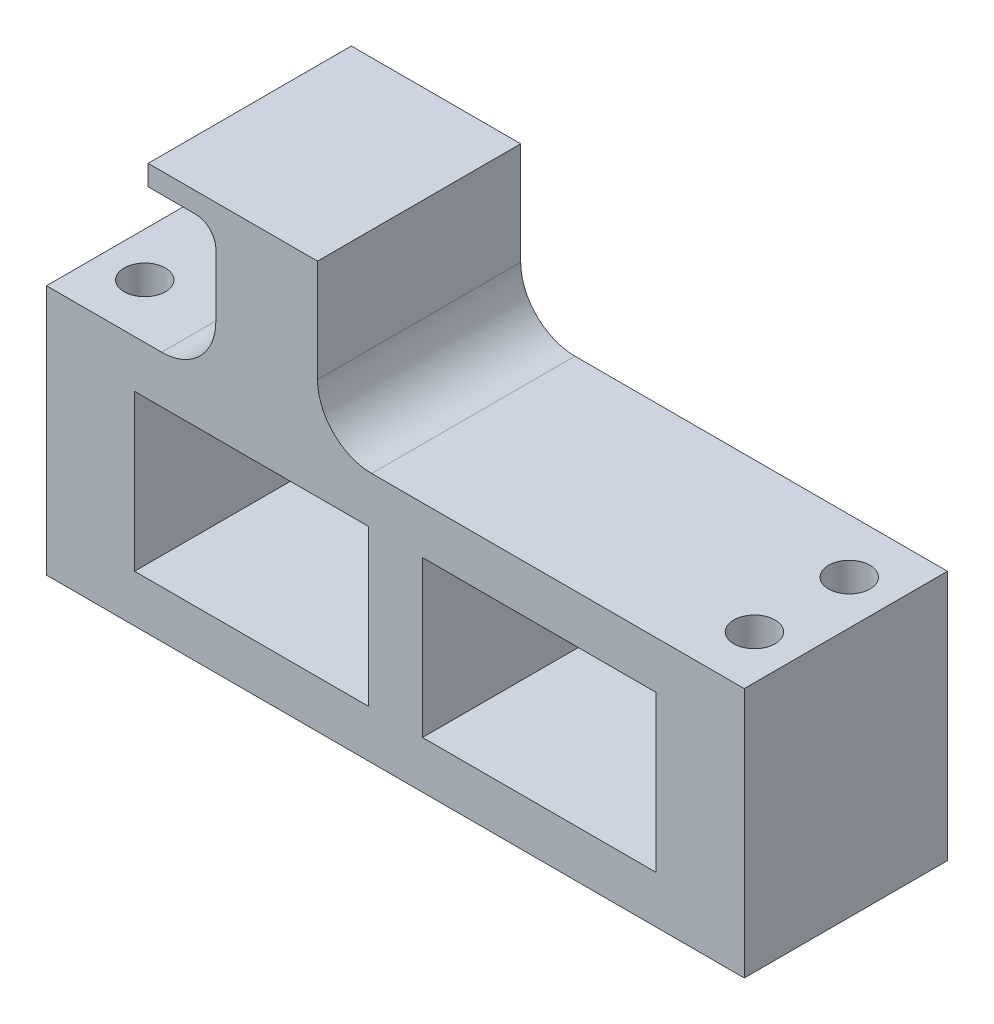
ISO-10303-21;
HEADER;
FILE_DESCRIPTION(('STEP AP214'),'2;1');
FILE_NAME('part.step','',(''),(''),'','','');
FILE_SCHEMA(('AUTOMOTIVE_DESIGN { 1 0 10303 214 1 1 1 1 }'));
ENDSEC;
DATA;
#1=APPLICATION_CONTEXT('core data for automotive mechanical design processes');
#2=APPLICATION_PROTOCOL_DEFINITION('international standard','automotive_design',2000,#1);
#3=PRODUCT_CONTEXT('',#1,'mechanical');
#4=PRODUCT('Part','Part','',(#3));
#5=PRODUCT_RELATED_PRODUCT_CATEGORY('part','',(#4));
#6=PRODUCT_DEFINITION_FORMATION('','',#4);
#7=PRODUCT_DEFINITION_CONTEXT('part definition',#1,'design');
#8=PRODUCT_DEFINITION('design','',#6,#7);
#9=PRODUCT_DEFINITION_SHAPE('','',#8);
#10=(LENGTH_UNIT() NAMED_UNIT(*) SI_UNIT(.MILLI.,.METRE.));
#11=(NAMED_UNIT(*) PLANE_ANGLE_UNIT() SI_UNIT($,.RADIAN.));
#12=(NAMED_UNIT(*) SI_UNIT($,.STERADIAN.) SOLID_ANGLE_UNIT());
#13=UNCERTAINTY_MEASURE_WITH_UNIT(LENGTH_MEASURE(1.E-05),#10,'distance_accuracy_value','');
#14=(GEOMETRIC_REPRESENTATION_CONTEXT(3) GLOBAL_UNCERTAINTY_ASSIGNED_CONTEXT((#13)) GLOBAL_UNIT_ASSIGNED_CONTEXT((#10,
#11,#12)) REPRESENTATION_CONTEXT('',''));
#15=CARTESIAN_POINT('',(0.,0.,0.));
#16=DIRECTION('',(0.,0.,1.));
#17=DIRECTION('',(1.,0.,0.));
#18=AXIS2_PLACEMENT_3D('',#15,#16,#17);
#19=CARTESIAN_POINT('',(0.,37.,0.));
#20=DIRECTION('',(0.,-1.,0.));
#21=DIRECTION('',(0.,0.,-1.));
#22=AXIS2_PLACEMENT_3D('',#19,#20,#21);
#23=PLANE('',#22);
#24=CARTESIAN_POINT('',(6.5,37.,-8.));
#25=DIRECTION('',(0.,-1.,0.));
#26=DIRECTION('',(0.,0.,-1.));
#27=AXIS2_PLACEMENT_3D('',#24,#25,#26);
#28=CIRCLE('',#27,3.05);
#29=CARTESIAN_POINT('',(6.5,37.,-11.05));
#30=VERTEX_POINT('',#29);
#31=EDGE_CURVE('E385',#30,#30,#28,.T.);
#32=ORIENTED_EDGE('',*,*,#31,.T.);
#33=EDGE_LOOP('',(#32));
#34=FACE_BOUND('',#33,.T.);
#35=CARTESIAN_POINT('',(6.5,37.,-22.));
#36=DIRECTION('',(0.,-1.,0.));
#37=DIRECTION('',(0.,0.,-1.));
#38=AXIS2_PLACEMENT_3D('',#35,#36,#37);
#39=CIRCLE('',#38,3.05);
#40=CARTESIAN_POINT('',(6.5,37.,-25.05));
#41=VERTEX_POINT('',#40);
#42=EDGE_CURVE('E388',#41,#41,#39,.T.);
#43=ORIENTED_EDGE('',*,*,#42,.T.);
#44=EDGE_LOOP('',(#43));
#45=FACE_BOUND('',#44,.T.);
#46=DIRECTION('',(1.,0.,0.));
#47=VECTOR('',#46,1.);
#48=CARTESIAN_POINT('',(0.,37.,0.));
#49=LINE('',#48,#47);
#50=CARTESIAN_POINT('',(0.,37.,0.));
#51=VERTEX_POINT('',#50);
#52=CARTESIAN_POINT('',(17.,37.,0.));
#53=VERTEX_POINT('',#52);
#54=EDGE_CURVE('E224',#51,#53,#49,.T.);
#55=ORIENTED_EDGE('',*,*,#54,.T.);
#56=DIRECTION('',(0.,0.,1.));
#57=VECTOR('',#56,1.);
#58=CARTESIAN_POINT('',(17.,37.,-30.));
#59=LINE('',#58,#57);
#60=CARTESIAN_POINT('',(17.,37.,-30.));
#61=VERTEX_POINT('',#60);
#62=EDGE_CURVE('E57',#53,#61,#59,.F.);
#63=ORIENTED_EDGE('',*,*,#62,.T.);
#64=DIRECTION('',(-1.,0.,0.));
#65=VECTOR('',#64,1.);
#66=CARTESIAN_POINT('',(0.,37.,-30.));
#67=LINE('',#66,#65);
#68=CARTESIAN_POINT('',(0.,37.,-30.));
#69=VERTEX_POINT('',#68);
#70=EDGE_CURVE('E229',#61,#69,#67,.T.);
#71=ORIENTED_EDGE('',*,*,#70,.T.);
#72=DIRECTION('',(0.,0.,1.));
#73=VECTOR('',#72,1.);
#74=CARTESIAN_POINT('',(0.,37.,0.));
#75=LINE('',#74,#73);
#76=EDGE_CURVE('E219',#69,#51,#75,.T.);
#77=ORIENTED_EDGE('',*,*,#76,.T.);
#78=EDGE_LOOP('',(#55,#63,#71,#77));
#79=FACE_BOUND('',#78,.T.);
#80=ADVANCED_FACE('F36',(#34,#45,#79),#23,.F.);
#81=CARTESIAN_POINT('',(96.5,37.,-22.));
#82=DIRECTION('',(0.,-1.,0.));
#83=DIRECTION('',(0.,0.,-1.));
#84=AXIS2_PLACEMENT_3D('',#81,#82,#83);
#85=CIRCLE('',#84,3.04999999999999);
#86=CARTESIAN_POINT('',(96.5,37.,-25.05));
#87=VERTEX_POINT('',#86);
#88=EDGE_CURVE('E377',#87,#87,#85,.T.);
#89=ORIENTED_EDGE('',*,*,#88,.T.);
#90=EDGE_LOOP('',(#89));
#91=FACE_BOUND('',#90,.T.);
#92=CARTESIAN_POINT('',(96.5,37.,-8.));
#93=DIRECTION('',(0.,-1.,0.));
#94=DIRECTION('',(0.,0.,-1.));
#95=AXIS2_PLACEMENT_3D('',#92,#93,#94);
#96=CIRCLE('',#95,3.04999999999999);
#97=CARTESIAN_POINT('',(96.5,37.,-11.05));
#98=VERTEX_POINT('',#97);
#99=EDGE_CURVE('E382',#98,#98,#96,.T.);
#100=ORIENTED_EDGE('',*,*,#99,.T.);
#101=EDGE_LOOP('',(#100));
#102=FACE_BOUND('',#101,.T.);
#103=CARTESIAN_POINT('',(103.,37.,-30.));
#104=VERTEX_POINT('',#103);
#105=CARTESIAN_POINT('',(48.,37.,-30.));
#106=VERTEX_POINT('',#105);
#107=EDGE_CURVE('E230',#104,#106,#67,.T.);
#108=ORIENTED_EDGE('',*,*,#107,.T.);
#109=DIRECTION('',(0.,0.,-1.));
#110=VECTOR('',#109,1.);
#111=CARTESIAN_POINT('',(48.,37.,0.));
#112=LINE('',#111,#110);
#113=CARTESIAN_POINT('',(48.,37.,0.));
#114=VERTEX_POINT('',#113);
#115=EDGE_CURVE('E321',#106,#114,#112,.F.);
#116=ORIENTED_EDGE('',*,*,#115,.T.);
#117=CARTESIAN_POINT('',(103.,37.,0.));
#118=VERTEX_POINT('',#117);
#119=EDGE_CURVE('E222',#114,#118,#49,.T.);
#120=ORIENTED_EDGE('',*,*,#119,.T.);
#121=DIRECTION('',(0.,0.,-1.));
#122=VECTOR('',#121,1.);
#123=CARTESIAN_POINT('',(103.,37.,0.));
#124=LINE('',#123,#122);
#125=EDGE_CURVE('E226',#118,#104,#124,.T.);
#126=ORIENTED_EDGE('',*,*,#125,.T.);
#127=EDGE_LOOP('',(#108,#116,#120,#126));
#128=FACE_BOUND('',#127,.T.);
#129=ADVANCED_FACE('F345',(#91,#102,#128),#23,.F.);
#130=CARTESIAN_POINT('',(0.,7.,0.));
#131=DIRECTION('',(0.,-1.,0.));
#132=DIRECTION('',(0.,0.,-1.));
#133=AXIS2_PLACEMENT_3D('',#130,#131,#132);
#134=PLANE('',#133);
#135=DIRECTION('',(0.,0.,1.));
#136=VECTOR('',#135,1.);
#137=CARTESIAN_POINT('',(47.5,7.,0.));
#138=LINE('',#137,#136);
#139=CARTESIAN_POINT('',(47.5,7.,-30.));
#140=VERTEX_POINT('',#139);
#141=CARTESIAN_POINT('',(47.5,7.,0.));
#142=VERTEX_POINT('',#141);
#143=EDGE_CURVE('E248',#140,#142,#138,.T.);
#144=ORIENTED_EDGE('',*,*,#143,.F.);
#145=DIRECTION('',(1.,0.,0.));
#146=VECTOR('',#145,1.);
#147=CARTESIAN_POINT('',(0.,7.,-30.));
#148=LINE('',#147,#146);
#149=CARTESIAN_POINT('',(13.,7.,-30.));
#150=VERTEX_POINT('',#149);
#151=EDGE_CURVE('E282',#150,#140,#148,.T.);
#152=ORIENTED_EDGE('',*,*,#151,.F.);
#153=DIRECTION('',(0.,0.,-1.));
#154=VECTOR('',#153,1.);
#155=CARTESIAN_POINT('',(13.,7.,0.));
#156=LINE('',#155,#154);
#157=CARTESIAN_POINT('',(13.,7.,0.));
#158=VERTEX_POINT('',#157);
#159=EDGE_CURVE('E269',#158,#150,#156,.T.);
#160=ORIENTED_EDGE('',*,*,#159,.F.);
#161=DIRECTION('',(1.,0.,0.));
#162=VECTOR('',#161,1.);
#163=CARTESIAN_POINT('',(0.,7.,0.));
#164=LINE('',#163,#162);
#165=EDGE_CURVE('E287',#158,#142,#164,.T.);
#166=ORIENTED_EDGE('',*,*,#165,.T.);
#167=EDGE_LOOP('',(#144,#152,#160,#166));
#168=FACE_BOUND('',#167,.T.);
#169=ADVANCED_FACE('F426',(#168),#134,.F.);
#170=CARTESIAN_POINT('',(55.5,7.,0.));
#171=VERTEX_POINT('',#170);
#172=CARTESIAN_POINT('',(90.,7.,0.));
#173=VERTEX_POINT('',#172);
#174=EDGE_CURVE('E285',#171,#173,#164,.T.);
#175=ORIENTED_EDGE('',*,*,#174,.T.);
#176=DIRECTION('',(0.,0.,-1.));
#177=VECTOR('',#176,1.);
#178=CARTESIAN_POINT('',(90.,7.,0.));
#179=LINE('',#178,#177);
#180=CARTESIAN_POINT('',(90.,7.,-30.));
#181=VERTEX_POINT('',#180);
#182=EDGE_CURVE('E233',#173,#181,#179,.T.);
#183=ORIENTED_EDGE('',*,*,#182,.T.);
#184=CARTESIAN_POINT('',(55.5,7.,-30.));
#185=VERTEX_POINT('',#184);
#186=EDGE_CURVE('E286',#185,#181,#148,.T.);
#187=ORIENTED_EDGE('',*,*,#186,.F.);
#188=DIRECTION('',(0.,0.,1.));
#189=VECTOR('',#188,1.);
#190=CARTESIAN_POINT('',(55.5,7.,0.));
#191=LINE('',#190,#189);
#192=EDGE_CURVE('E253',#185,#171,#191,.T.);
#193=ORIENTED_EDGE('',*,*,#192,.T.);
#194=EDGE_LOOP('',(#175,#183,#187,#193));
#195=FACE_BOUND('',#194,.T.);
#196=ADVANCED_FACE('F451',(#195),#134,.F.);
#197=CARTESIAN_POINT('',(0.,7.,0.));
#198=DIRECTION('',(-1.,0.,0.));
#199=DIRECTION('',(0.,0.,1.));
#200=AXIS2_PLACEMENT_3D('',#197,#198,#199);
#201=PLANE('',#200);
#202=DIRECTION('',(0.,0.,-1.));
#203=VECTOR('',#202,1.);
#204=CARTESIAN_POINT('',(0.,0.,0.));
#205=LINE('',#204,#203);
#206=CARTESIAN_POINT('',(0.,0.,0.));
#207=VERTEX_POINT('',#206);
#208=CARTESIAN_POINT('',(0.,0.,-30.));
#209=VERTEX_POINT('',#208);
#210=EDGE_CURVE('E281',#207,#209,#205,.T.);
#211=ORIENTED_EDGE('',*,*,#210,.F.);
#212=DIRECTION('',(0.,-1.,0.));
#213=VECTOR('',#212,1.);
#214=CARTESIAN_POINT('',(0.,7.,0.));
#215=LINE('',#214,#213);
#216=EDGE_CURVE('E301',#51,#207,#215,.T.);
#217=ORIENTED_EDGE('',*,*,#216,.F.);
#218=ORIENTED_EDGE('',*,*,#76,.F.);
#219=DIRECTION('',(0.,-1.,0.));
#220=VECTOR('',#219,1.);
#221=CARTESIAN_POINT('',(0.,7.,-30.));
#222=LINE('',#221,#220);
#223=EDGE_CURVE('E290',#69,#209,#222,.T.);
#224=ORIENTED_EDGE('',*,*,#223,.T.);
#225=EDGE_LOOP('',(#211,#217,#218,#224));
#226=FACE_BOUND('',#225,.T.);
#227=ADVANCED_FACE('F357',(#226),#201,.T.);
#228=CARTESIAN_POINT('',(0.,7.,0.));
#229=DIRECTION('',(0.,0.,-1.));
#230=DIRECTION('',(-1.,0.,0.));
#231=AXIS2_PLACEMENT_3D('',#228,#229,#230);
#232=PLANE('',#231);
#233=DIRECTION('',(0.,-1.,0.));
#234=VECTOR('',#233,1.);
#235=CARTESIAN_POINT('',(13.,30.,0.));
#236=LINE('',#235,#234);
#237=CARTESIAN_POINT('',(13.,30.,0.));
#238=VERTEX_POINT('',#237);
#239=EDGE_CURVE('E278',#238,#158,#236,.T.);
#240=ORIENTED_EDGE('',*,*,#239,.F.);
#241=DIRECTION('',(1.,0.,0.));
#242=VECTOR('',#241,1.);
#243=CARTESIAN_POINT('',(0.,30.,0.));
#244=LINE('',#243,#242);
#245=CARTESIAN_POINT('',(47.5,30.,0.));
#246=VERTEX_POINT('',#245);
#247=EDGE_CURVE('E236',#238,#246,#244,.T.);
#248=ORIENTED_EDGE('',*,*,#247,.T.);
#249=DIRECTION('',(0.,-1.,0.));
#250=VECTOR('',#249,1.);
#251=CARTESIAN_POINT('',(47.5,30.,0.));
#252=LINE('',#251,#250);
#253=EDGE_CURVE('E264',#246,#142,#252,.T.);
#254=ORIENTED_EDGE('',*,*,#253,.T.);
#255=ORIENTED_EDGE('',*,*,#165,.F.);
#256=EDGE_LOOP('',(#240,#248,#254,#255));
#257=FACE_BOUND('',#256,.T.);
#258=DIRECTION('',(0.,-1.,0.));
#259=VECTOR('',#258,1.);
#260=CARTESIAN_POINT('',(55.5,30.,0.));
#261=LINE('',#260,#259);
#262=CARTESIAN_POINT('',(55.5,30.,0.));
#263=VERTEX_POINT('',#262);
#264=EDGE_CURVE('E262',#263,#171,#261,.T.);
#265=ORIENTED_EDGE('',*,*,#264,.F.);
#266=CARTESIAN_POINT('',(90.,30.,0.));
#267=VERTEX_POINT('',#266);
#268=EDGE_CURVE('E218',#263,#267,#244,.T.);
#269=ORIENTED_EDGE('',*,*,#268,.T.);
#270=DIRECTION('',(0.,-1.,0.));
#271=VECTOR('',#270,1.);
#272=CARTESIAN_POINT('',(90.,30.,0.));
#273=LINE('',#272,#271);
#274=EDGE_CURVE('E246',#267,#173,#273,.T.);
#275=ORIENTED_EDGE('',*,*,#274,.T.);
#276=ORIENTED_EDGE('',*,*,#174,.F.);
#277=EDGE_LOOP('',(#265,#269,#275,#276));
#278=FACE_BOUND('',#277,.T.);
#279=DIRECTION('',(1.,0.,0.));
#280=VECTOR('',#279,1.);
#281=CARTESIAN_POINT('',(0.,0.,0.));
#282=LINE('',#281,#280);
#283=CARTESIAN_POINT('',(103.,0.,0.));
#284=VERTEX_POINT('',#283);
#285=EDGE_CURVE('E299',#207,#284,#282,.T.);
#286=ORIENTED_EDGE('',*,*,#285,.T.);
#287=DIRECTION('',(0.,-1.,0.));
#288=VECTOR('',#287,1.);
#289=CARTESIAN_POINT('',(103.,7.,0.));
#290=LINE('',#289,#288);
#291=EDGE_CURVE('E304',#118,#284,#290,.T.);
#292=ORIENTED_EDGE('',*,*,#291,.F.);
#293=ORIENTED_EDGE('',*,*,#119,.F.);
#294=CARTESIAN_POINT('',(48.,45.,0.));
#295=DIRECTION('',(0.,0.,-1.));
#296=DIRECTION('',(-1.,0.,0.));
#297=AXIS2_PLACEMENT_3D('',#294,#295,#296);
#298=CIRCLE('',#297,8.);
#299=CARTESIAN_POINT('',(40.,45.,0.));
#300=VERTEX_POINT('',#299);
#301=EDGE_CURVE('E329',#114,#300,#298,.T.);
#302=ORIENTED_EDGE('',*,*,#301,.T.);
#303=DIRECTION('',(0.,-1.,0.));
#304=VECTOR('',#303,1.);
#305=CARTESIAN_POINT('',(40.,57.15,0.));
#306=LINE('',#305,#304);
#307=CARTESIAN_POINT('',(40.,60.15,0.));
#308=VERTEX_POINT('',#307);
#309=EDGE_CURVE('E185',#308,#300,#306,.T.);
#310=ORIENTED_EDGE('',*,*,#309,.F.);
#311=DIRECTION('',(1.,0.,0.));
#312=VECTOR('',#311,1.);
#313=CARTESIAN_POINT('',(15.,60.15,0.));
#314=LINE('',#313,#312);
#315=CARTESIAN_POINT('',(15.,60.15,0.));
#316=VERTEX_POINT('',#315);
#317=EDGE_CURVE('E177',#316,#308,#314,.T.);
#318=ORIENTED_EDGE('',*,*,#317,.F.);
#319=DIRECTION('',(0.,-1.,0.));
#320=VECTOR('',#319,1.);
#321=CARTESIAN_POINT('',(15.,60.15,0.));
#322=LINE('',#321,#320);
#323=CARTESIAN_POINT('',(15.,57.15,0.));
#324=VERTEX_POINT('',#323);
#325=EDGE_CURVE('E182',#316,#324,#322,.T.);
#326=ORIENTED_EDGE('',*,*,#325,.T.);
#327=DIRECTION('',(1.,0.,0.));
#328=VECTOR('',#327,1.);
#329=CARTESIAN_POINT('',(15.,57.15,0.));
#330=LINE('',#329,#328);
#331=CARTESIAN_POINT('',(22.,57.15,0.));
#332=VERTEX_POINT('',#331);
#333=EDGE_CURVE('E366',#324,#332,#330,.T.);
#334=ORIENTED_EDGE('',*,*,#333,.T.);
#335=CARTESIAN_POINT('',(22.,54.15,0.));
#336=DIRECTION('',(0.,0.,-1.));
#337=DIRECTION('',(-1.,0.,0.));
#338=AXIS2_PLACEMENT_3D('',#335,#336,#337);
#339=CIRCLE('',#338,3.);
#340=CARTESIAN_POINT('',(25.,54.15,0.));
#341=VERTEX_POINT('',#340);
#342=EDGE_CURVE('E314',#332,#341,#339,.T.);
#343=ORIENTED_EDGE('',*,*,#342,.T.);
#344=DIRECTION('',(0.,-1.,0.));
#345=VECTOR('',#344,1.);
#346=CARTESIAN_POINT('',(25.,57.15,0.));
#347=LINE('',#346,#345);
#348=CARTESIAN_POINT('',(25.,45.,0.));
#349=VERTEX_POINT('',#348);
#350=EDGE_CURVE('E216',#341,#349,#347,.T.);
#351=ORIENTED_EDGE('',*,*,#350,.T.);
#352=CARTESIAN_POINT('',(17.,45.,0.));
#353=DIRECTION('',(0.,0.,-1.));
#354=DIRECTION('',(-1.,0.,0.));
#355=AXIS2_PLACEMENT_3D('',#352,#353,#354);
#356=CIRCLE('',#355,8.);
#357=EDGE_CURVE('E44',#349,#53,#356,.T.);
#358=ORIENTED_EDGE('',*,*,#357,.T.);
#359=ORIENTED_EDGE('',*,*,#54,.F.);
#360=ORIENTED_EDGE('',*,*,#216,.T.);
#361=EDGE_LOOP('',(#286,#292,#293,#302,#310,#318,#326,#334,#343,#351,#358,#359,#360));
#362=FACE_BOUND('',#361,.T.);
#363=ADVANCED_FACE('F179',(#257,#278,#362),#232,.F.);
#364=CARTESIAN_POINT('',(103.,7.,0.));
#365=DIRECTION('',(-1.,0.,0.));
#366=DIRECTION('',(0.,0.,1.));
#367=AXIS2_PLACEMENT_3D('',#364,#365,#366);
#368=PLANE('',#367);
#369=DIRECTION('',(0.,0.,-1.));
#370=VECTOR('',#369,1.);
#371=CARTESIAN_POINT('',(103.,0.,0.));
#372=LINE('',#371,#370);
#373=CARTESIAN_POINT('',(103.,0.,-30.));
#374=VERTEX_POINT('',#373);
#375=EDGE_CURVE('E296',#284,#374,#372,.T.);
#376=ORIENTED_EDGE('',*,*,#375,.T.);
#377=DIRECTION('',(0.,-1.,0.));
#378=VECTOR('',#377,1.);
#379=CARTESIAN_POINT('',(103.,7.,-30.));
#380=LINE('',#379,#378);
#381=EDGE_CURVE('E307',#104,#374,#380,.T.);
#382=ORIENTED_EDGE('',*,*,#381,.F.);
#383=ORIENTED_EDGE('',*,*,#125,.F.);
#384=ORIENTED_EDGE('',*,*,#291,.T.);
#385=EDGE_LOOP('',(#376,#382,#383,#384));
#386=FACE_BOUND('',#385,.T.);
#387=ADVANCED_FACE('F348',(#386),#368,.F.);
#388=CARTESIAN_POINT('',(0.,7.,-30.));
#389=DIRECTION('',(0.,0.,-1.));
#390=DIRECTION('',(-1.,0.,0.));
#391=AXIS2_PLACEMENT_3D('',#388,#389,#390);
#392=PLANE('',#391);
#393=ORIENTED_EDGE('',*,*,#223,.F.);
#394=ORIENTED_EDGE('',*,*,#70,.F.);
#395=CARTESIAN_POINT('',(17.,45.,-30.));
#396=DIRECTION('',(0.,0.,-1.));
#397=DIRECTION('',(-1.,0.,0.));
#398=AXIS2_PLACEMENT_3D('',#395,#396,#397);
#399=CIRCLE('',#398,8.);
#400=CARTESIAN_POINT('',(25.,45.,-30.));
#401=VERTEX_POINT('',#400);
#402=EDGE_CURVE('E11',#61,#401,#399,.F.);
#403=ORIENTED_EDGE('',*,*,#402,.T.);
#404=DIRECTION('',(0.,-1.,0.));
#405=VECTOR('',#404,1.);
#406=CARTESIAN_POINT('',(25.,57.15,-30.));
#407=LINE('',#406,#405);
#408=CARTESIAN_POINT('',(25.,54.15,-30.));
#409=VERTEX_POINT('',#408);
#410=EDGE_CURVE('E204',#409,#401,#407,.T.);
#411=ORIENTED_EDGE('',*,*,#410,.F.);
#412=CARTESIAN_POINT('',(22.,54.15,-30.));
#413=DIRECTION('',(0.,0.,-1.));
#414=DIRECTION('',(-1.,0.,0.));
#415=AXIS2_PLACEMENT_3D('',#412,#413,#414);
#416=CIRCLE('',#415,3.);
#417=CARTESIAN_POINT('',(22.,57.15,-30.));
#418=VERTEX_POINT('',#417);
#419=EDGE_CURVE('E316',#409,#418,#416,.F.);
#420=ORIENTED_EDGE('',*,*,#419,.T.);
#421=DIRECTION('',(-1.,0.,0.));
#422=VECTOR('',#421,1.);
#423=CARTESIAN_POINT('',(15.,57.15,-30.));
#424=LINE('',#423,#422);
#425=CARTESIAN_POINT('',(15.,57.15,-30.));
#426=VERTEX_POINT('',#425);
#427=EDGE_CURVE('E199',#418,#426,#424,.T.);
#428=ORIENTED_EDGE('',*,*,#427,.T.);
#429=DIRECTION('',(0.,-1.,0.));
#430=VECTOR('',#429,1.);
#431=CARTESIAN_POINT('',(15.,60.15,-30.));
#432=LINE('',#431,#430);
#433=CARTESIAN_POINT('',(15.,60.15,-30.));
#434=VERTEX_POINT('',#433);
#435=EDGE_CURVE('E205',#434,#426,#432,.T.);
#436=ORIENTED_EDGE('',*,*,#435,.F.);
#437=DIRECTION('',(-1.,0.,0.));
#438=VECTOR('',#437,1.);
#439=CARTESIAN_POINT('',(15.,60.15,-30.));
#440=LINE('',#439,#438);
#441=CARTESIAN_POINT('',(40.,60.15,-30.));
#442=VERTEX_POINT('',#441);
#443=EDGE_CURVE('E195',#442,#434,#440,.T.);
#444=ORIENTED_EDGE('',*,*,#443,.F.);
#445=DIRECTION('',(0.,-1.,0.));
#446=VECTOR('',#445,1.);
#447=CARTESIAN_POINT('',(40.,57.15,-30.));
#448=LINE('',#447,#446);
#449=CARTESIAN_POINT('',(40.,45.,-30.));
#450=VERTEX_POINT('',#449);
#451=EDGE_CURVE('E208',#442,#450,#448,.T.);
#452=ORIENTED_EDGE('',*,*,#451,.T.);
#453=CARTESIAN_POINT('',(48.,45.,-30.));
#454=DIRECTION('',(0.,0.,-1.));
#455=DIRECTION('',(-1.,0.,0.));
#456=AXIS2_PLACEMENT_3D('',#453,#454,#455);
#457=CIRCLE('',#456,8.);
#458=EDGE_CURVE('E327',#450,#106,#457,.F.);
#459=ORIENTED_EDGE('',*,*,#458,.T.);
#460=ORIENTED_EDGE('',*,*,#107,.F.);
#461=ORIENTED_EDGE('',*,*,#381,.T.);
#462=DIRECTION('',(1.,0.,0.));
#463=VECTOR('',#462,1.);
#464=CARTESIAN_POINT('',(0.,0.,-30.));
#465=LINE('',#464,#463);
#466=EDGE_CURVE('E293',#209,#374,#465,.T.);
#467=ORIENTED_EDGE('',*,*,#466,.F.);
#468=EDGE_LOOP('',(#393,#394,#403,#411,#420,#428,#436,#444,#452,#459,#460,#461,#467));
#469=FACE_BOUND('',#468,.T.);
#470=DIRECTION('',(0.,-1.,0.));
#471=VECTOR('',#470,1.);
#472=CARTESIAN_POINT('',(47.5,30.,-30.));
#473=LINE('',#472,#471);
#474=CARTESIAN_POINT('',(47.5,30.,-30.));
#475=VERTEX_POINT('',#474);
#476=EDGE_CURVE('E267',#475,#140,#473,.T.);
#477=ORIENTED_EDGE('',*,*,#476,.F.);
#478=DIRECTION('',(-1.,0.,0.));
#479=VECTOR('',#478,1.);
#480=CARTESIAN_POINT('',(0.,30.,-30.));
#481=LINE('',#480,#479);
#482=CARTESIAN_POINT('',(13.,30.,-30.));
#483=VERTEX_POINT('',#482);
#484=EDGE_CURVE('E237',#475,#483,#481,.T.);
#485=ORIENTED_EDGE('',*,*,#484,.T.);
#486=DIRECTION('',(0.,-1.,0.));
#487=VECTOR('',#486,1.);
#488=CARTESIAN_POINT('',(13.,30.,-30.));
#489=LINE('',#488,#487);
#490=EDGE_CURVE('E273',#483,#150,#489,.T.);
#491=ORIENTED_EDGE('',*,*,#490,.T.);
#492=ORIENTED_EDGE('',*,*,#151,.T.);
#493=EDGE_LOOP('',(#477,#485,#491,#492));
#494=FACE_BOUND('',#493,.T.);
#495=CARTESIAN_POINT('',(90.,30.,-30.));
#496=VERTEX_POINT('',#495);
#497=CARTESIAN_POINT('',(55.5,30.,-30.));
#498=VERTEX_POINT('',#497);
#499=EDGE_CURVE('E223',#496,#498,#481,.T.);
#500=ORIENTED_EDGE('',*,*,#499,.T.);
#501=DIRECTION('',(0.,-1.,0.));
#502=VECTOR('',#501,1.);
#503=CARTESIAN_POINT('',(55.5,30.,-30.));
#504=LINE('',#503,#502);
#505=EDGE_CURVE('E256',#498,#185,#504,.T.);
#506=ORIENTED_EDGE('',*,*,#505,.T.);
#507=ORIENTED_EDGE('',*,*,#186,.T.);
#508=DIRECTION('',(0.,-1.,0.));
#509=VECTOR('',#508,1.);
#510=CARTESIAN_POINT('',(90.,30.,-30.));
#511=LINE('',#510,#509);
#512=EDGE_CURVE('E242',#496,#181,#511,.T.);
#513=ORIENTED_EDGE('',*,*,#512,.F.);
#514=EDGE_LOOP('',(#500,#506,#507,#513));
#515=FACE_BOUND('',#514,.T.);
#516=ADVANCED_FACE('F342',(#469,#494,#515),#392,.T.);
#517=CARTESIAN_POINT('',(0.,0.,0.));
#518=DIRECTION('',(0.,-1.,0.));
#519=DIRECTION('',(0.,0.,-1.));
#520=AXIS2_PLACEMENT_3D('',#517,#518,#519);
#521=PLANE('',#520);
#522=CARTESIAN_POINT('',(96.5,0.,-22.));
#523=DIRECTION('',(0.,-1.,0.));
#524=DIRECTION('',(0.,0.,1.));
#525=AXIS2_PLACEMENT_3D('',#522,#523,#524);
#526=CIRCLE('',#525,3.04999999999999);
#527=CARTESIAN_POINT('',(96.5,0.,-18.95));
#528=VERTEX_POINT('',#527);
#529=EDGE_CURVE('E395',#528,#528,#526,.T.);
#530=ORIENTED_EDGE('',*,*,#529,.F.);
#531=EDGE_LOOP('',(#530));
#532=FACE_BOUND('',#531,.T.);
#533=CARTESIAN_POINT('',(96.5,0.,-8.));
#534=DIRECTION('',(0.,-1.,0.));
#535=DIRECTION('',(0.,0.,-1.));
#536=AXIS2_PLACEMENT_3D('',#533,#534,#535);
#537=CIRCLE('',#536,3.04999999999999);
#538=CARTESIAN_POINT('',(96.5,0.,-11.05));
#539=VERTEX_POINT('',#538);
#540=EDGE_CURVE('E398',#539,#539,#537,.T.);
#541=ORIENTED_EDGE('',*,*,#540,.F.);
#542=EDGE_LOOP('',(#541));
#543=FACE_BOUND('',#542,.T.);
#544=CARTESIAN_POINT('',(6.5,0.,-8.));
#545=DIRECTION('',(0.,-1.,0.));
#546=DIRECTION('',(0.,0.,1.));
#547=AXIS2_PLACEMENT_3D('',#544,#545,#546);
#548=CIRCLE('',#547,3.05);
#549=CARTESIAN_POINT('',(6.5,0.,-4.95));
#550=VERTEX_POINT('',#549);
#551=EDGE_CURVE('E394',#550,#550,#548,.T.);
#552=ORIENTED_EDGE('',*,*,#551,.F.);
#553=EDGE_LOOP('',(#552));
#554=FACE_BOUND('',#553,.T.);
#555=CARTESIAN_POINT('',(6.5,0.,-22.));
#556=DIRECTION('',(0.,-1.,0.));
#557=DIRECTION('',(0.,0.,-1.));
#558=AXIS2_PLACEMENT_3D('',#555,#556,#557);
#559=CIRCLE('',#558,3.05);
#560=CARTESIAN_POINT('',(6.5,0.,-25.05));
#561=VERTEX_POINT('',#560);
#562=EDGE_CURVE('E391',#561,#561,#559,.T.);
#563=ORIENTED_EDGE('',*,*,#562,.F.);
#564=EDGE_LOOP('',(#563));
#565=FACE_BOUND('',#564,.T.);
#566=ORIENTED_EDGE('',*,*,#210,.T.);
#567=ORIENTED_EDGE('',*,*,#466,.T.);
#568=ORIENTED_EDGE('',*,*,#375,.F.);
#569=ORIENTED_EDGE('',*,*,#285,.F.);
#570=EDGE_LOOP('',(#566,#567,#568,#569));
#571=FACE_BOUND('',#570,.T.);
#572=ADVANCED_FACE('F355',(#532,#543,#554,#565,#571),#521,.T.);
#573=CARTESIAN_POINT('',(13.,30.,0.));
#574=DIRECTION('',(-1.,0.,0.));
#575=DIRECTION('',(0.,0.,1.));
#576=AXIS2_PLACEMENT_3D('',#573,#574,#575);
#577=PLANE('',#576);
#578=ORIENTED_EDGE('',*,*,#159,.T.);
#579=ORIENTED_EDGE('',*,*,#490,.F.);
#580=DIRECTION('',(0.,0.,-1.));
#581=VECTOR('',#580,1.);
#582=CARTESIAN_POINT('',(13.,30.,0.));
#583=LINE('',#582,#581);
#584=EDGE_CURVE('E270',#238,#483,#583,.T.);
#585=ORIENTED_EDGE('',*,*,#584,.F.);
#586=ORIENTED_EDGE('',*,*,#239,.T.);
#587=EDGE_LOOP('',(#578,#579,#585,#586));
#588=FACE_BOUND('',#587,.T.);
#589=ADVANCED_FACE('F409',(#588),#577,.F.);
#590=CARTESIAN_POINT('',(47.5,30.,0.));
#591=DIRECTION('',(1.,0.,0.));
#592=DIRECTION('',(0.,0.,-1.));
#593=AXIS2_PLACEMENT_3D('',#590,#591,#592);
#594=PLANE('',#593);
#595=ORIENTED_EDGE('',*,*,#143,.T.);
#596=ORIENTED_EDGE('',*,*,#253,.F.);
#597=DIRECTION('',(0.,0.,1.));
#598=VECTOR('',#597,1.);
#599=CARTESIAN_POINT('',(47.5,30.,0.));
#600=LINE('',#599,#598);
#601=EDGE_CURVE('E249',#475,#246,#600,.T.);
#602=ORIENTED_EDGE('',*,*,#601,.F.);
#603=ORIENTED_EDGE('',*,*,#476,.T.);
#604=EDGE_LOOP('',(#595,#596,#602,#603));
#605=FACE_BOUND('',#604,.T.);
#606=ADVANCED_FACE('F443',(#605),#594,.F.);
#607=CARTESIAN_POINT('',(55.5,30.,0.));
#608=DIRECTION('',(1.,0.,0.));
#609=DIRECTION('',(0.,0.,-1.));
#610=AXIS2_PLACEMENT_3D('',#607,#608,#609);
#611=PLANE('',#610);
#612=ORIENTED_EDGE('',*,*,#192,.F.);
#613=ORIENTED_EDGE('',*,*,#505,.F.);
#614=DIRECTION('',(0.,0.,1.));
#615=VECTOR('',#614,1.);
#616=CARTESIAN_POINT('',(55.5,30.,0.));
#617=LINE('',#616,#615);
#618=EDGE_CURVE('E252',#498,#263,#617,.T.);
#619=ORIENTED_EDGE('',*,*,#618,.T.);
#620=ORIENTED_EDGE('',*,*,#264,.T.);
#621=EDGE_LOOP('',(#612,#613,#619,#620));
#622=FACE_BOUND('',#621,.T.);
#623=ADVANCED_FACE('F439',(#622),#611,.T.);
#624=CARTESIAN_POINT('',(90.,30.,0.));
#625=DIRECTION('',(-1.,0.,0.));
#626=DIRECTION('',(0.,0.,1.));
#627=AXIS2_PLACEMENT_3D('',#624,#625,#626);
#628=PLANE('',#627);
#629=ORIENTED_EDGE('',*,*,#182,.F.);
#630=ORIENTED_EDGE('',*,*,#274,.F.);
#631=DIRECTION('',(0.,0.,-1.));
#632=VECTOR('',#631,1.);
#633=CARTESIAN_POINT('',(90.,30.,0.));
#634=LINE('',#633,#632);
#635=EDGE_CURVE('E240',#267,#496,#634,.T.);
#636=ORIENTED_EDGE('',*,*,#635,.T.);
#637=ORIENTED_EDGE('',*,*,#512,.T.);
#638=EDGE_LOOP('',(#629,#630,#636,#637));
#639=FACE_BOUND('',#638,.T.);
#640=ADVANCED_FACE('F436',(#639),#628,.T.);
#641=CARTESIAN_POINT('',(0.,30.,0.));
#642=DIRECTION('',(0.,-1.,0.));
#643=DIRECTION('',(0.,0.,-1.));
#644=AXIS2_PLACEMENT_3D('',#641,#642,#643);
#645=PLANE('',#644);
#646=ORIENTED_EDGE('',*,*,#584,.T.);
#647=ORIENTED_EDGE('',*,*,#484,.F.);
#648=ORIENTED_EDGE('',*,*,#601,.T.);
#649=ORIENTED_EDGE('',*,*,#247,.F.);
#650=EDGE_LOOP('',(#646,#647,#648,#649));
#651=FACE_BOUND('',#650,.T.);
#652=ADVANCED_FACE('F434',(#651),#645,.T.);
#653=ORIENTED_EDGE('',*,*,#268,.F.);
#654=ORIENTED_EDGE('',*,*,#618,.F.);
#655=ORIENTED_EDGE('',*,*,#499,.F.);
#656=ORIENTED_EDGE('',*,*,#635,.F.);
#657=EDGE_LOOP('',(#653,#654,#655,#656));
#658=FACE_BOUND('',#657,.T.);
#659=ADVANCED_FACE('F431',(#658),#645,.T.);
#660=CARTESIAN_POINT('',(25.,57.15,0.));
#661=DIRECTION('',(1.,0.,0.));
#662=DIRECTION('',(0.,0.,-1.));
#663=AXIS2_PLACEMENT_3D('',#660,#661,#662);
#664=PLANE('',#663);
#665=ORIENTED_EDGE('',*,*,#410,.T.);
#666=DIRECTION('',(0.,0.,1.));
#667=VECTOR('',#666,1.);
#668=CARTESIAN_POINT('',(25.,45.,0.));
#669=LINE('',#668,#667);
#670=EDGE_CURVE('E323',#401,#349,#669,.T.);
#671=ORIENTED_EDGE('',*,*,#670,.T.);
#672=ORIENTED_EDGE('',*,*,#350,.F.);
#673=DIRECTION('',(0.,0.,1.));
#674=VECTOR('',#673,1.);
#675=CARTESIAN_POINT('',(25.,54.15,-30.));
#676=LINE('',#675,#674);
#677=EDGE_CURVE('E312',#341,#409,#676,.F.);
#678=ORIENTED_EDGE('',*,*,#677,.T.);
#679=EDGE_LOOP('',(#665,#671,#672,#678));
#680=FACE_BOUND('',#679,.T.);
#681=ADVANCED_FACE('F364',(#680),#664,.F.);
#682=CARTESIAN_POINT('',(40.,57.15,0.));
#683=DIRECTION('',(-1.,0.,0.));
#684=DIRECTION('',(0.,0.,1.));
#685=AXIS2_PLACEMENT_3D('',#682,#683,#684);
#686=PLANE('',#685);
#687=ORIENTED_EDGE('',*,*,#309,.T.);
#688=DIRECTION('',(0.,0.,-1.));
#689=VECTOR('',#688,1.);
#690=CARTESIAN_POINT('',(40.,45.,-30.));
#691=LINE('',#690,#689);
#692=EDGE_CURVE('E318',#300,#450,#691,.T.);
#693=ORIENTED_EDGE('',*,*,#692,.T.);
#694=ORIENTED_EDGE('',*,*,#451,.F.);
#695=DIRECTION('',(0.,0.,-1.));
#696=VECTOR('',#695,1.);
#697=CARTESIAN_POINT('',(40.,60.15,-30.));
#698=LINE('',#697,#696);
#699=EDGE_CURVE('E189',#308,#442,#698,.T.);
#700=ORIENTED_EDGE('',*,*,#699,.F.);
#701=EDGE_LOOP('',(#687,#693,#694,#700));
#702=FACE_BOUND('',#701,.T.);
#703=ADVANCED_FACE('F337',(#702),#686,.F.);
#704=CARTESIAN_POINT('',(0.,57.15,0.));
#705=DIRECTION('',(0.,1.,0.));
#706=DIRECTION('',(0.,0.,1.));
#707=AXIS2_PLACEMENT_3D('',#704,#705,#706);
#708=PLANE('',#707);
#709=ORIENTED_EDGE('',*,*,#427,.F.);
#710=DIRECTION('',(0.,0.,1.));
#711=VECTOR('',#710,1.);
#712=CARTESIAN_POINT('',(22.,57.15,0.));
#713=LINE('',#712,#711);
#714=EDGE_CURVE('E303',#418,#332,#713,.T.);
#715=ORIENTED_EDGE('',*,*,#714,.T.);
#716=ORIENTED_EDGE('',*,*,#333,.F.);
#717=DIRECTION('',(0.,0.,1.));
#718=VECTOR('',#717,1.);
#719=CARTESIAN_POINT('',(15.,57.15,-30.));
#720=LINE('',#719,#718);
#721=EDGE_CURVE('E203',#426,#324,#720,.T.);
#722=ORIENTED_EDGE('',*,*,#721,.F.);
#723=EDGE_LOOP('',(#709,#715,#716,#722));
#724=FACE_BOUND('',#723,.T.);
#725=ADVANCED_FACE('F373',(#724),#708,.F.);
#726=CARTESIAN_POINT('',(15.,60.15,-30.));
#727=DIRECTION('',(1.,0.,0.));
#728=DIRECTION('',(0.,0.,-1.));
#729=AXIS2_PLACEMENT_3D('',#726,#727,#728);
#730=PLANE('',#729);
#731=ORIENTED_EDGE('',*,*,#721,.T.);
#732=ORIENTED_EDGE('',*,*,#325,.F.);
#733=DIRECTION('',(0.,0.,1.));
#734=VECTOR('',#733,1.);
#735=CARTESIAN_POINT('',(15.,60.15,-30.));
#736=LINE('',#735,#734);
#737=EDGE_CURVE('E190',#434,#316,#736,.T.);
#738=ORIENTED_EDGE('',*,*,#737,.F.);
#739=ORIENTED_EDGE('',*,*,#435,.T.);
#740=EDGE_LOOP('',(#731,#732,#738,#739));
#741=FACE_BOUND('',#740,.T.);
#742=ADVANCED_FACE('F201',(#741),#730,.F.);
#743=CARTESIAN_POINT('',(0.,60.15,0.));
#744=DIRECTION('',(0.,1.,0.));
#745=DIRECTION('',(0.,0.,1.));
#746=AXIS2_PLACEMENT_3D('',#743,#744,#745);
#747=PLANE('',#746);
#748=ORIENTED_EDGE('',*,*,#737,.T.);
#749=ORIENTED_EDGE('',*,*,#317,.T.);
#750=ORIENTED_EDGE('',*,*,#699,.T.);
#751=ORIENTED_EDGE('',*,*,#443,.T.);
#752=EDGE_LOOP('',(#748,#749,#750,#751));
#753=FACE_BOUND('',#752,.T.);
#754=ADVANCED_FACE('F193',(#753),#747,.T.);
#755=CARTESIAN_POINT('',(22.,54.15,0.));
#756=DIRECTION('',(0.,0.,-1.));
#757=DIRECTION('',(-1.,0.,0.));
#758=AXIS2_PLACEMENT_3D('',#755,#756,#757);
#759=CYLINDRICAL_SURFACE('',#758,3.);
#760=ORIENTED_EDGE('',*,*,#419,.F.);
#761=ORIENTED_EDGE('',*,*,#677,.F.);
#762=ORIENTED_EDGE('',*,*,#342,.F.);
#763=ORIENTED_EDGE('',*,*,#714,.F.);
#764=EDGE_LOOP('',(#760,#761,#762,#763));
#765=FACE_BOUND('',#764,.T.);
#766=ADVANCED_FACE('F370',(#765),#759,.F.);
#767=CARTESIAN_POINT('',(48.,45.,0.));
#768=DIRECTION('',(0.,0.,1.));
#769=DIRECTION('',(1.,0.,0.));
#770=AXIS2_PLACEMENT_3D('',#767,#768,#769);
#771=CYLINDRICAL_SURFACE('',#770,8.);
#772=ORIENTED_EDGE('',*,*,#301,.F.);
#773=ORIENTED_EDGE('',*,*,#115,.F.);
#774=ORIENTED_EDGE('',*,*,#458,.F.);
#775=ORIENTED_EDGE('',*,*,#692,.F.);
#776=EDGE_LOOP('',(#772,#773,#774,#775));
#777=FACE_BOUND('',#776,.T.);
#778=ADVANCED_FACE('F338',(#777),#771,.F.);
#779=CARTESIAN_POINT('',(17.,45.,0.));
#780=DIRECTION('',(0.,0.,-1.));
#781=DIRECTION('',(-1.,0.,0.));
#782=AXIS2_PLACEMENT_3D('',#779,#780,#781);
#783=CYLINDRICAL_SURFACE('',#782,8.);
#784=ORIENTED_EDGE('',*,*,#402,.F.);
#785=ORIENTED_EDGE('',*,*,#62,.F.);
#786=ORIENTED_EDGE('',*,*,#357,.F.);
#787=ORIENTED_EDGE('',*,*,#670,.F.);
#788=EDGE_LOOP('',(#784,#785,#786,#787));
#789=FACE_BOUND('',#788,.T.);
#790=ADVANCED_FACE('F38',(#789),#783,.F.);
#791=CARTESIAN_POINT('',(6.5,40.,-22.));
#792=DIRECTION('',(0.,-1.,0.));
#793=DIRECTION('',(0.,0.,-1.));
#794=AXIS2_PLACEMENT_3D('',#791,#792,#793);
#795=CYLINDRICAL_SURFACE('',#794,3.05);
#796=ORIENTED_EDGE('',*,*,#562,.T.);
#797=EDGE_LOOP('',(#796));
#798=FACE_BOUND('',#797,.T.);
#799=ORIENTED_EDGE('',*,*,#42,.F.);
#800=EDGE_LOOP('',(#799));
#801=FACE_BOUND('',#800,.T.);
#802=ADVANCED_FACE('F414',(#798,#801),#795,.F.);
#803=CARTESIAN_POINT('',(6.5,40.,-8.));
#804=DIRECTION('',(0.,-1.,0.));
#805=DIRECTION('',(0.,0.,-1.));
#806=AXIS2_PLACEMENT_3D('',#803,#804,#805);
#807=CYLINDRICAL_SURFACE('',#806,3.05);
#808=ORIENTED_EDGE('',*,*,#551,.T.);
#809=EDGE_LOOP('',(#808));
#810=FACE_BOUND('',#809,.T.);
#811=ORIENTED_EDGE('',*,*,#31,.F.);
#812=EDGE_LOOP('',(#811));
#813=FACE_BOUND('',#812,.T.);
#814=ADVANCED_FACE('F404',(#810,#813),#807,.F.);
#815=CARTESIAN_POINT('',(96.5,40.,-8.));
#816=DIRECTION('',(0.,-1.,0.));
#817=DIRECTION('',(0.,0.,-1.));
#818=AXIS2_PLACEMENT_3D('',#815,#816,#817);
#819=CYLINDRICAL_SURFACE('',#818,3.04999999999999);
#820=ORIENTED_EDGE('',*,*,#540,.T.);
#821=EDGE_LOOP('',(#820));
#822=FACE_BOUND('',#821,.T.);
#823=ORIENTED_EDGE('',*,*,#99,.F.);
#824=EDGE_LOOP('',(#823));
#825=FACE_BOUND('',#824,.T.);
#826=ADVANCED_FACE('F482',(#822,#825),#819,.F.);
#827=CARTESIAN_POINT('',(96.5,40.,-22.));
#828=DIRECTION('',(0.,-1.,0.));
#829=DIRECTION('',(0.,0.,-1.));
#830=AXIS2_PLACEMENT_3D('',#827,#828,#829);
#831=CYLINDRICAL_SURFACE('',#830,3.04999999999999);
#832=ORIENTED_EDGE('',*,*,#529,.T.);
#833=EDGE_LOOP('',(#832));
#834=FACE_BOUND('',#833,.T.);
#835=ORIENTED_EDGE('',*,*,#88,.F.);
#836=EDGE_LOOP('',(#835));
#837=FACE_BOUND('',#836,.T.);
#838=ADVANCED_FACE('F489',(#834,#837),#831,.F.);
#839=CLOSED_SHELL('',(#80,#129,#169,#196,#227,#363,#387,#516,#572,#589,#606,#623,#640,#652,#659,
#681,#703,#725,#742,#754,#766,#778,#790,#802,#814,#826,#838));
#840=MANIFOLD_SOLID_BREP('B2',#839);
#841=ADVANCED_BREP_SHAPE_REPRESENTATION('',(#18,#840),#14);
#842=SHAPE_DEFINITION_REPRESENTATION(#9,#841);
ENDSEC;
END-ISO-10303-21;
